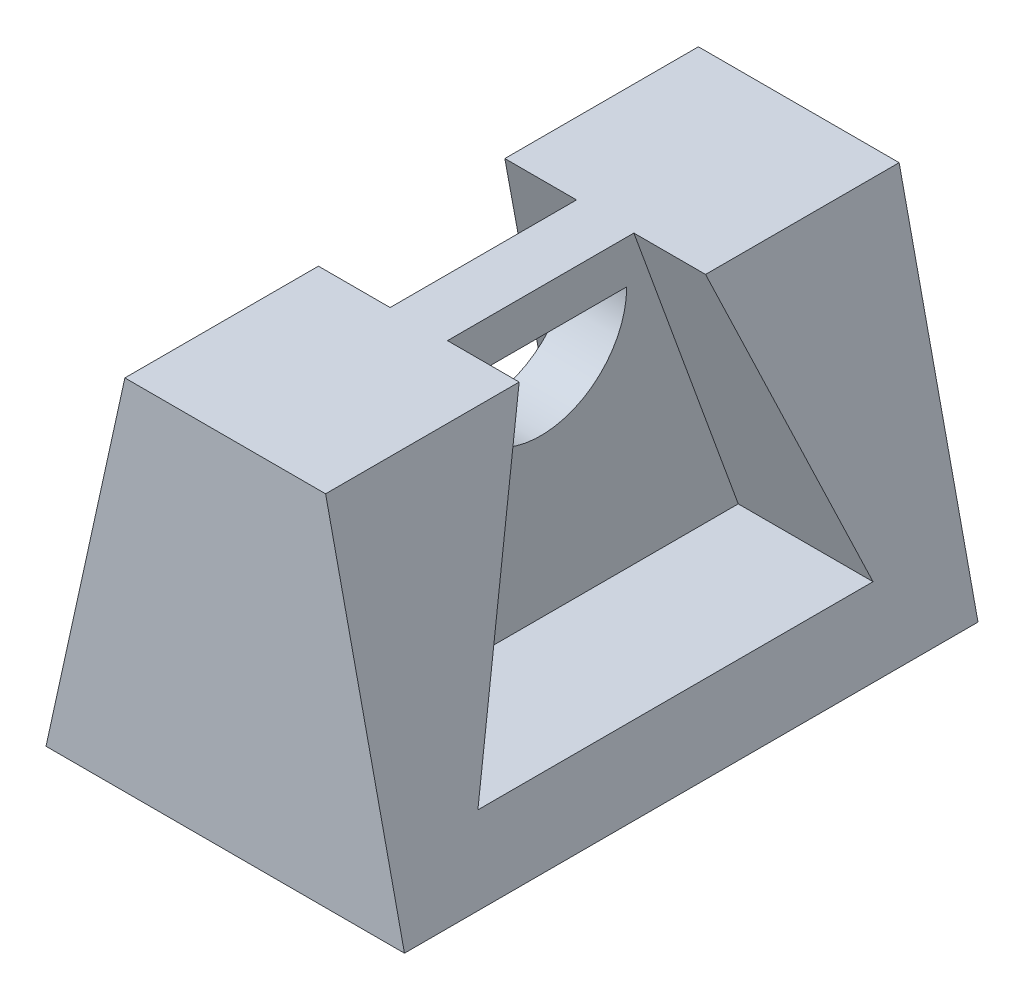
ISO-10303-21;
HEADER;
FILE_DESCRIPTION(('STEP AP214'),'2;1');
FILE_NAME('part.step','',(''),(''),'','','');
FILE_SCHEMA(('AUTOMOTIVE_DESIGN { 1 0 10303 214 1 1 1 1 }'));
ENDSEC;
DATA;
#1=APPLICATION_CONTEXT('core data for automotive mechanical design processes');
#2=APPLICATION_PROTOCOL_DEFINITION('international standard','automotive_design',2000,#1);
#3=PRODUCT_CONTEXT('',#1,'mechanical');
#4=PRODUCT('Part','Part','',(#3));
#5=PRODUCT_RELATED_PRODUCT_CATEGORY('part','',(#4));
#6=PRODUCT_DEFINITION_FORMATION('','',#4);
#7=PRODUCT_DEFINITION_CONTEXT('part definition',#1,'design');
#8=PRODUCT_DEFINITION('design','',#6,#7);
#9=PRODUCT_DEFINITION_SHAPE('','',#8);
#10=(LENGTH_UNIT() NAMED_UNIT(*) SI_UNIT(.MILLI.,.METRE.));
#11=(NAMED_UNIT(*) PLANE_ANGLE_UNIT() SI_UNIT($,.RADIAN.));
#12=(NAMED_UNIT(*) SI_UNIT($,.STERADIAN.) SOLID_ANGLE_UNIT());
#13=UNCERTAINTY_MEASURE_WITH_UNIT(LENGTH_MEASURE(1.E-05),#10,'distance_accuracy_value','');
#14=(GEOMETRIC_REPRESENTATION_CONTEXT(3) GLOBAL_UNCERTAINTY_ASSIGNED_CONTEXT((#13)) GLOBAL_UNIT_ASSIGNED_CONTEXT((#10,
#11,#12)) REPRESENTATION_CONTEXT('',''));
#15=CARTESIAN_POINT('',(0.,0.,0.));
#16=DIRECTION('',(0.,0.,1.));
#17=DIRECTION('',(1.,0.,0.));
#18=AXIS2_PLACEMENT_3D('',#15,#16,#17);
#19=CARTESIAN_POINT('',(14.,42.6470588235294,40.));
#20=DIRECTION('',(-0.97664446670509,-0.21486178267512,0.));
#21=DIRECTION('',(0.21486178267512,-0.97664446670509,0.));
#22=AXIS2_PLACEMENT_3D('',#19,#20,#21);
#23=PLANE('',#22);
#24=DIRECTION('',(-0.202451425739384,0.920233753360837,0.334937694790415));
#25=VECTOR('',#24,1.);
#26=CARTESIAN_POINT('',(10.4061434662583,58.9827703405369,-7.05428725224958));
#27=LINE('',#26,#25);
#28=CARTESIAN_POINT('',(22.8,2.64705882352941,-27.5588093706483));
#29=VERTEX_POINT('',#28);
#30=CARTESIAN_POINT('',(14.,42.6470588235294,-13.));
#31=VERTEX_POINT('',#30);
#32=EDGE_CURVE('E185',#29,#31,#27,.T.);
#33=ORIENTED_EDGE('',*,*,#32,.F.);
#34=DIRECTION('',(0.,0.,-1.));
#35=VECTOR('',#34,1.);
#36=CARTESIAN_POINT('',(22.8,2.64705882352941,40.));
#37=LINE('',#36,#35);
#38=CARTESIAN_POINT('',(22.8,2.64705882352941,27.5588093706483));
#39=VERTEX_POINT('',#38);
#40=EDGE_CURVE('E11',#39,#29,#37,.T.);
#41=ORIENTED_EDGE('',*,*,#40,.F.);
#42=DIRECTION('',(0.202451425739384,-0.920233753360837,0.334937694790415));
#43=VECTOR('',#42,1.);
#44=CARTESIAN_POINT('',(15.8308325737929,34.3250925790162,16.028948003571));
#45=LINE('',#44,#43);
#46=CARTESIAN_POINT('',(14.,42.6470588235294,13.));
#47=VERTEX_POINT('',#46);
#48=EDGE_CURVE('E180',#47,#39,#45,.T.);
#49=ORIENTED_EDGE('',*,*,#48,.F.);
#50=DIRECTION('',(0.,0.,-1.));
#51=VECTOR('',#50,1.);
#52=CARTESIAN_POINT('',(14.,42.6470588235294,40.));
#53=LINE('',#52,#51);
#54=CARTESIAN_POINT('',(14.,42.6470588235294,40.));
#55=VERTEX_POINT('',#54);
#56=EDGE_CURVE('E252',#55,#47,#53,.T.);
#57=ORIENTED_EDGE('',*,*,#56,.F.);
#58=DIRECTION('',(-0.21486178267512,0.97664446670509,0.));
#59=VECTOR('',#58,1.);
#60=CARTESIAN_POINT('',(14.,42.6470588235294,40.));
#61=LINE('',#60,#59);
#62=CARTESIAN_POINT('',(25.,-7.35294117647056,40.));
#63=VERTEX_POINT('',#62);
#64=EDGE_CURVE('E227',#63,#55,#61,.T.);
#65=ORIENTED_EDGE('',*,*,#64,.F.);
#66=DIRECTION('',(0.,0.,-1.));
#67=VECTOR('',#66,1.);
#68=CARTESIAN_POINT('',(25.,-7.35294117647056,40.));
#69=LINE('',#68,#67);
#70=CARTESIAN_POINT('',(25.,-7.35294117647056,-40.));
#71=VERTEX_POINT('',#70);
#72=EDGE_CURVE('E256',#63,#71,#69,.T.);
#73=ORIENTED_EDGE('',*,*,#72,.T.);
#74=DIRECTION('',(-0.21486178267512,0.97664446670509,0.));
#75=VECTOR('',#74,1.);
#76=CARTESIAN_POINT('',(14.,42.6470588235294,-40.));
#77=LINE('',#76,#75);
#78=CARTESIAN_POINT('',(14.,42.6470588235294,-40.));
#79=VERTEX_POINT('',#78);
#80=EDGE_CURVE('E240',#71,#79,#77,.T.);
#81=ORIENTED_EDGE('',*,*,#80,.T.);
#82=EDGE_CURVE('E251',#31,#79,#53,.T.);
#83=ORIENTED_EDGE('',*,*,#82,.F.);
#84=EDGE_LOOP('',(#33,#41,#49,#57,#65,#73,#81,#83));
#85=FACE_BOUND('',#84,.T.);
#86=ADVANCED_FACE('F39',(#85),#23,.F.);
#87=CARTESIAN_POINT('',(14.,42.6470588235294,40.));
#88=DIRECTION('',(0.,-1.,0.));
#89=DIRECTION('',(1.,0.,0.));
#90=AXIS2_PLACEMENT_3D('',#87,#88,#89);
#91=PLANE('',#90);
#92=DIRECTION('',(-1.,0.,0.));
#93=VECTOR('',#92,1.);
#94=CARTESIAN_POINT('',(14.,42.6470588235294,-13.));
#95=LINE('',#94,#93);
#96=CARTESIAN_POINT('',(4.,42.6470588235294,-13.));
#97=VERTEX_POINT('',#96);
#98=EDGE_CURVE('E48',#31,#97,#95,.T.);
#99=ORIENTED_EDGE('',*,*,#98,.F.);
#100=ORIENTED_EDGE('',*,*,#82,.T.);
#101=DIRECTION('',(-1.,0.,0.));
#102=VECTOR('',#101,1.);
#103=CARTESIAN_POINT('',(14.,42.6470588235294,-40.));
#104=LINE('',#103,#102);
#105=CARTESIAN_POINT('',(-14.,42.6470588235294,-40.));
#106=VERTEX_POINT('',#105);
#107=EDGE_CURVE('E224',#79,#106,#104,.T.);
#108=ORIENTED_EDGE('',*,*,#107,.T.);
#109=DIRECTION('',(0.,0.,-1.));
#110=VECTOR('',#109,1.);
#111=CARTESIAN_POINT('',(-14.,42.6470588235294,40.));
#112=LINE('',#111,#110);
#113=CARTESIAN_POINT('',(-14.,42.6470588235294,-13.));
#114=VERTEX_POINT('',#113);
#115=EDGE_CURVE('E233',#114,#106,#112,.T.);
#116=ORIENTED_EDGE('',*,*,#115,.F.);
#117=DIRECTION('',(1.,0.,0.));
#118=VECTOR('',#117,1.);
#119=CARTESIAN_POINT('',(14.,42.6470588235294,-13.));
#120=LINE('',#119,#118);
#121=CARTESIAN_POINT('',(-4.,42.6470588235294,-13.));
#122=VERTEX_POINT('',#121);
#123=EDGE_CURVE('E268',#114,#122,#120,.T.);
#124=ORIENTED_EDGE('',*,*,#123,.T.);
#125=DIRECTION('',(0.,0.,1.));
#126=VECTOR('',#125,1.);
#127=CARTESIAN_POINT('',(-4.,42.6470588235294,-13.));
#128=LINE('',#127,#126);
#129=CARTESIAN_POINT('',(-4.,42.6470588235294,13.));
#130=VERTEX_POINT('',#129);
#131=EDGE_CURVE('E192',#122,#130,#128,.T.);
#132=ORIENTED_EDGE('',*,*,#131,.T.);
#133=DIRECTION('',(-1.,0.,0.));
#134=VECTOR('',#133,1.);
#135=CARTESIAN_POINT('',(14.,42.6470588235294,13.));
#136=LINE('',#135,#134);
#137=CARTESIAN_POINT('',(-14.,42.6470588235294,13.));
#138=VERTEX_POINT('',#137);
#139=EDGE_CURVE('E264',#130,#138,#136,.T.);
#140=ORIENTED_EDGE('',*,*,#139,.T.);
#141=CARTESIAN_POINT('',(-14.,42.6470588235294,40.));
#142=VERTEX_POINT('',#141);
#143=EDGE_CURVE('E247',#142,#138,#112,.T.);
#144=ORIENTED_EDGE('',*,*,#143,.F.);
#145=DIRECTION('',(-1.,0.,0.));
#146=VECTOR('',#145,1.);
#147=CARTESIAN_POINT('',(14.,42.6470588235294,40.));
#148=LINE('',#147,#146);
#149=EDGE_CURVE('E230',#55,#142,#148,.T.);
#150=ORIENTED_EDGE('',*,*,#149,.F.);
#151=ORIENTED_EDGE('',*,*,#56,.T.);
#152=DIRECTION('',(1.,0.,0.));
#153=VECTOR('',#152,1.);
#154=CARTESIAN_POINT('',(14.,42.6470588235294,13.));
#155=LINE('',#154,#153);
#156=CARTESIAN_POINT('',(4.,42.6470588235294,13.));
#157=VERTEX_POINT('',#156);
#158=EDGE_CURVE('E276',#157,#47,#155,.T.);
#159=ORIENTED_EDGE('',*,*,#158,.F.);
#160=DIRECTION('',(0.,0.,1.));
#161=VECTOR('',#160,1.);
#162=CARTESIAN_POINT('',(4.,42.6470588235294,-13.));
#163=LINE('',#162,#161);
#164=EDGE_CURVE('E173',#97,#157,#163,.T.);
#165=ORIENTED_EDGE('',*,*,#164,.F.);
#166=EDGE_LOOP('',(#99,#100,#108,#116,#124,#132,#140,#144,#150,#151,#159,#165));
#167=FACE_BOUND('',#166,.T.);
#168=ADVANCED_FACE('F290',(#167),#91,.F.);
#169=CARTESIAN_POINT('',(-14.,42.6470588235294,40.));
#170=DIRECTION('',(0.97664446670509,-0.21486178267512,0.));
#171=DIRECTION('',(0.21486178267512,0.97664446670509,0.));
#172=AXIS2_PLACEMENT_3D('',#169,#170,#171);
#173=PLANE('',#172);
#174=DIRECTION('',(0.,0.,-1.));
#175=VECTOR('',#174,1.);
#176=CARTESIAN_POINT('',(-22.8,2.64705882352941,40.));
#177=LINE('',#176,#175);
#178=CARTESIAN_POINT('',(-22.8,2.64705882352941,27.5588093706483));
#179=VERTEX_POINT('',#178);
#180=CARTESIAN_POINT('',(-22.8,2.64705882352941,-27.5588093706483));
#181=VERTEX_POINT('',#180);
#182=EDGE_CURVE('E272',#179,#181,#177,.T.);
#183=ORIENTED_EDGE('',*,*,#182,.T.);
#184=DIRECTION('',(0.202451425739384,0.920233753360837,0.334937694790415));
#185=VECTOR('',#184,1.);
#186=CARTESIAN_POINT('',(-10.4061434662583,58.9827703405369,-7.05428725224959));
#187=LINE('',#186,#185);
#188=EDGE_CURVE('E214',#181,#114,#187,.T.);
#189=ORIENTED_EDGE('',*,*,#188,.T.);
#190=ORIENTED_EDGE('',*,*,#115,.T.);
#191=DIRECTION('',(-0.21486178267512,-0.97664446670509,0.));
#192=VECTOR('',#191,1.);
#193=CARTESIAN_POINT('',(-14.,42.6470588235294,-40.));
#194=LINE('',#193,#192);
#195=CARTESIAN_POINT('',(-25.,-7.35294117647059,-40.));
#196=VERTEX_POINT('',#195);
#197=EDGE_CURVE('E218',#106,#196,#194,.T.);
#198=ORIENTED_EDGE('',*,*,#197,.T.);
#199=DIRECTION('',(0.,0.,-1.));
#200=VECTOR('',#199,1.);
#201=CARTESIAN_POINT('',(-25.,-7.35294117647059,40.));
#202=LINE('',#201,#200);
#203=CARTESIAN_POINT('',(-25.,-7.35294117647059,40.));
#204=VERTEX_POINT('',#203);
#205=EDGE_CURVE('E260',#204,#196,#202,.T.);
#206=ORIENTED_EDGE('',*,*,#205,.F.);
#207=DIRECTION('',(-0.21486178267512,-0.97664446670509,0.));
#208=VECTOR('',#207,1.);
#209=CARTESIAN_POINT('',(-14.,42.6470588235294,40.));
#210=LINE('',#209,#208);
#211=EDGE_CURVE('E219',#142,#204,#210,.T.);
#212=ORIENTED_EDGE('',*,*,#211,.F.);
#213=ORIENTED_EDGE('',*,*,#143,.T.);
#214=DIRECTION('',(-0.202451425739384,-0.920233753360837,0.334937694790415));
#215=VECTOR('',#214,1.);
#216=CARTESIAN_POINT('',(-15.8308325737929,34.3250925790161,16.028948003571));
#217=LINE('',#216,#215);
#218=EDGE_CURVE('E208',#138,#179,#217,.T.);
#219=ORIENTED_EDGE('',*,*,#218,.T.);
#220=EDGE_LOOP('',(#183,#189,#190,#198,#206,#212,#213,#219));
#221=FACE_BOUND('',#220,.T.);
#222=ADVANCED_FACE('F41',(#221),#173,.F.);
#223=CARTESIAN_POINT('',(-25.,-7.35294117647059,40.));
#224=DIRECTION('',(0.,1.,0.));
#225=DIRECTION('',(-1.,0.,0.));
#226=AXIS2_PLACEMENT_3D('',#223,#224,#225);
#227=PLANE('',#226);
#228=DIRECTION('',(1.,0.,0.));
#229=VECTOR('',#228,1.);
#230=CARTESIAN_POINT('',(-25.,-7.35294117647059,-40.));
#231=LINE('',#230,#229);
#232=EDGE_CURVE('E237',#196,#71,#231,.T.);
#233=ORIENTED_EDGE('',*,*,#232,.T.);
#234=ORIENTED_EDGE('',*,*,#72,.F.);
#235=DIRECTION('',(1.,0.,0.));
#236=VECTOR('',#235,1.);
#237=CARTESIAN_POINT('',(-25.,-7.35294117647059,40.));
#238=LINE('',#237,#236);
#239=EDGE_CURVE('E223',#204,#63,#238,.T.);
#240=ORIENTED_EDGE('',*,*,#239,.F.);
#241=ORIENTED_EDGE('',*,*,#205,.T.);
#242=EDGE_LOOP('',(#233,#234,#240,#241));
#243=FACE_BOUND('',#242,.T.);
#244=ADVANCED_FACE('F317',(#243),#227,.F.);
#245=CARTESIAN_POINT('',(0.,0.,40.));
#246=DIRECTION('',(0.,0.,1.));
#247=DIRECTION('',(1.,0.,0.));
#248=AXIS2_PLACEMENT_3D('',#245,#246,#247);
#249=PLANE('',#248);
#250=ORIENTED_EDGE('',*,*,#211,.T.);
#251=ORIENTED_EDGE('',*,*,#239,.T.);
#252=ORIENTED_EDGE('',*,*,#64,.T.);
#253=ORIENTED_EDGE('',*,*,#149,.T.);
#254=EDGE_LOOP('',(#250,#251,#252,#253));
#255=FACE_BOUND('',#254,.T.);
#256=ADVANCED_FACE('F321',(#255),#249,.T.);
#257=CARTESIAN_POINT('',(0.,0.,-40.));
#258=DIRECTION('',(0.,0.,1.));
#259=DIRECTION('',(1.,0.,0.));
#260=AXIS2_PLACEMENT_3D('',#257,#258,#259);
#261=PLANE('',#260);
#262=ORIENTED_EDGE('',*,*,#197,.F.);
#263=ORIENTED_EDGE('',*,*,#107,.F.);
#264=ORIENTED_EDGE('',*,*,#80,.F.);
#265=ORIENTED_EDGE('',*,*,#232,.F.);
#266=EDGE_LOOP('',(#262,#263,#264,#265));
#267=FACE_BOUND('',#266,.T.);
#268=ADVANCED_FACE('F314',(#267),#261,.F.);
#269=CARTESIAN_POINT('',(-54.,2.64705882352941,27.5588093706483));
#270=DIRECTION('',(0.,-1.,0.));
#271=DIRECTION('',(0.,0.,-1.));
#272=AXIS2_PLACEMENT_3D('',#269,#270,#271);
#273=PLANE('',#272);
#274=DIRECTION('',(1.,0.,0.));
#275=VECTOR('',#274,1.);
#276=CARTESIAN_POINT('',(-54.,2.64705882352941,27.5588093706483));
#277=LINE('',#276,#275);
#278=CARTESIAN_POINT('',(-4.,2.64705882352941,27.5588093706483));
#279=VERTEX_POINT('',#278);
#280=EDGE_CURVE('E204',#179,#279,#277,.T.);
#281=ORIENTED_EDGE('',*,*,#280,.T.);
#282=DIRECTION('',(0.,0.,-1.));
#283=VECTOR('',#282,1.);
#284=CARTESIAN_POINT('',(-4.,2.64705882352941,27.5588093706483));
#285=LINE('',#284,#283);
#286=CARTESIAN_POINT('',(-4.,2.64705882352941,-27.5588093706483));
#287=VERTEX_POINT('',#286);
#288=EDGE_CURVE('E200',#279,#287,#285,.T.);
#289=ORIENTED_EDGE('',*,*,#288,.T.);
#290=DIRECTION('',(1.,0.,0.));
#291=VECTOR('',#290,1.);
#292=CARTESIAN_POINT('',(-54.,2.64705882352941,-27.5588093706483));
#293=LINE('',#292,#291);
#294=EDGE_CURVE('E205',#181,#287,#293,.T.);
#295=ORIENTED_EDGE('',*,*,#294,.F.);
#296=ORIENTED_EDGE('',*,*,#182,.F.);
#297=EDGE_LOOP('',(#281,#289,#295,#296));
#298=FACE_BOUND('',#297,.T.);
#299=ADVANCED_FACE('F331',(#298),#273,.F.);
#300=CARTESIAN_POINT('',(-54.,42.6470588235294,-13.));
#301=DIRECTION('',(0.,0.342020143325673,-0.939692620785907));
#302=DIRECTION('',(0.,0.939692620785907,0.342020143325673));
#303=AXIS2_PLACEMENT_3D('',#300,#301,#302);
#304=PLANE('',#303);
#305=ORIENTED_EDGE('',*,*,#294,.T.);
#306=DIRECTION('',(0.,0.939692620785907,0.342020143325673));
#307=VECTOR('',#306,1.);
#308=CARTESIAN_POINT('',(-4.,42.6470588235294,-13.));
#309=LINE('',#308,#307);
#310=EDGE_CURVE('E188',#287,#122,#309,.T.);
#311=ORIENTED_EDGE('',*,*,#310,.T.);
#312=ORIENTED_EDGE('',*,*,#123,.F.);
#313=ORIENTED_EDGE('',*,*,#188,.F.);
#314=EDGE_LOOP('',(#305,#311,#312,#313));
#315=FACE_BOUND('',#314,.T.);
#316=ADVANCED_FACE('F334',(#315),#304,.F.);
#317=CARTESIAN_POINT('',(-54.,42.6470588235294,13.));
#318=DIRECTION('',(0.,0.342020143325673,0.939692620785907));
#319=DIRECTION('',(0.,-0.939692620785907,0.342020143325673));
#320=AXIS2_PLACEMENT_3D('',#317,#318,#319);
#321=PLANE('',#320);
#322=ORIENTED_EDGE('',*,*,#139,.F.);
#323=DIRECTION('',(0.,-0.939692620785907,0.342020143325673));
#324=VECTOR('',#323,1.);
#325=CARTESIAN_POINT('',(-4.,42.6470588235294,13.));
#326=LINE('',#325,#324);
#327=EDGE_CURVE('E196',#130,#279,#326,.T.);
#328=ORIENTED_EDGE('',*,*,#327,.T.);
#329=ORIENTED_EDGE('',*,*,#280,.F.);
#330=ORIENTED_EDGE('',*,*,#218,.F.);
#331=EDGE_LOOP('',(#322,#328,#329,#330));
#332=FACE_BOUND('',#331,.T.);
#333=ADVANCED_FACE('F326',(#332),#321,.F.);
#334=CARTESIAN_POINT('',(-4.,0.,0.));
#335=DIRECTION('',(1.,0.,0.));
#336=DIRECTION('',(0.,0.,-1.));
#337=AXIS2_PLACEMENT_3D('',#334,#335,#336);
#338=PLANE('',#337);
#339=DIRECTION('',(0.,0.,-1.));
#340=VECTOR('',#339,1.);
#341=CARTESIAN_POINT('',(-4.,36.6470588235294,-12.));
#342=LINE('',#341,#340);
#343=CARTESIAN_POINT('',(-4.,36.6470588235294,12.));
#344=VERTEX_POINT('',#343);
#345=CARTESIAN_POINT('',(-4.,36.6470588235294,-12.));
#346=VERTEX_POINT('',#345);
#347=EDGE_CURVE('E146',#344,#346,#342,.T.);
#348=ORIENTED_EDGE('',*,*,#347,.F.);
#349=CARTESIAN_POINT('',(-4.,36.6470588235294,0.));
#350=DIRECTION('',(-1.,0.,0.));
#351=DIRECTION('',(0.,0.,1.));
#352=AXIS2_PLACEMENT_3D('',#349,#350,#351);
#353=CIRCLE('',#352,12.);
#354=EDGE_CURVE('E55',#346,#344,#353,.T.);
#355=ORIENTED_EDGE('',*,*,#354,.F.);
#356=EDGE_LOOP('',(#348,#355));
#357=FACE_BOUND('',#356,.T.);
#358=ORIENTED_EDGE('',*,*,#310,.F.);
#359=ORIENTED_EDGE('',*,*,#288,.F.);
#360=ORIENTED_EDGE('',*,*,#327,.F.);
#361=ORIENTED_EDGE('',*,*,#131,.F.);
#362=EDGE_LOOP('',(#358,#359,#360,#361));
#363=FACE_BOUND('',#362,.T.);
#364=ADVANCED_FACE('F151',(#357,#363),#338,.F.);
#365=CARTESIAN_POINT('',(54.,2.64705882352941,27.5588093706483));
#366=DIRECTION('',(0.,1.,0.));
#367=DIRECTION('',(0.,0.,1.));
#368=AXIS2_PLACEMENT_3D('',#365,#366,#367);
#369=PLANE('',#368);
#370=ORIENTED_EDGE('',*,*,#40,.T.);
#371=DIRECTION('',(-1.,0.,0.));
#372=VECTOR('',#371,1.);
#373=CARTESIAN_POINT('',(54.,2.64705882352941,-27.5588093706483));
#374=LINE('',#373,#372);
#375=CARTESIAN_POINT('',(4.,2.64705882352941,-27.5588093706483));
#376=VERTEX_POINT('',#375);
#377=EDGE_CURVE('E176',#29,#376,#374,.T.);
#378=ORIENTED_EDGE('',*,*,#377,.T.);
#379=DIRECTION('',(0.,0.,-1.));
#380=VECTOR('',#379,1.);
#381=CARTESIAN_POINT('',(4.,2.64705882352941,27.5588093706483));
#382=LINE('',#381,#380);
#383=CARTESIAN_POINT('',(4.,2.64705882352941,27.5588093706483));
#384=VERTEX_POINT('',#383);
#385=EDGE_CURVE('E165',#384,#376,#382,.T.);
#386=ORIENTED_EDGE('',*,*,#385,.F.);
#387=DIRECTION('',(-1.,0.,0.));
#388=VECTOR('',#387,1.);
#389=CARTESIAN_POINT('',(54.,2.64705882352941,27.5588093706483));
#390=LINE('',#389,#388);
#391=EDGE_CURVE('E177',#39,#384,#390,.T.);
#392=ORIENTED_EDGE('',*,*,#391,.F.);
#393=EDGE_LOOP('',(#370,#378,#386,#392));
#394=FACE_BOUND('',#393,.T.);
#395=ADVANCED_FACE('F301',(#394),#369,.T.);
#396=CARTESIAN_POINT('',(54.,42.6470588235294,-13.));
#397=DIRECTION('',(0.,-0.342020143325673,0.939692620785907));
#398=DIRECTION('',(0.,-0.939692620785907,-0.342020143325673));
#399=AXIS2_PLACEMENT_3D('',#396,#397,#398);
#400=PLANE('',#399);
#401=ORIENTED_EDGE('',*,*,#32,.T.);
#402=ORIENTED_EDGE('',*,*,#98,.T.);
#403=DIRECTION('',(0.,0.939692620785907,0.342020143325673));
#404=VECTOR('',#403,1.);
#405=CARTESIAN_POINT('',(4.,42.6470588235294,-13.));
#406=LINE('',#405,#404);
#407=EDGE_CURVE('E162',#376,#97,#406,.T.);
#408=ORIENTED_EDGE('',*,*,#407,.F.);
#409=ORIENTED_EDGE('',*,*,#377,.F.);
#410=EDGE_LOOP('',(#401,#402,#408,#409));
#411=FACE_BOUND('',#410,.T.);
#412=ADVANCED_FACE('F284',(#411),#400,.T.);
#413=CARTESIAN_POINT('',(54.,42.6470588235294,13.));
#414=DIRECTION('',(0.,-0.342020143325673,-0.939692620785907));
#415=DIRECTION('',(0.,0.939692620785907,-0.342020143325673));
#416=AXIS2_PLACEMENT_3D('',#413,#414,#415);
#417=PLANE('',#416);
#418=ORIENTED_EDGE('',*,*,#48,.T.);
#419=ORIENTED_EDGE('',*,*,#391,.T.);
#420=DIRECTION('',(0.,-0.939692620785907,0.342020143325673));
#421=VECTOR('',#420,1.);
#422=CARTESIAN_POINT('',(4.,42.6470588235294,13.));
#423=LINE('',#422,#421);
#424=EDGE_CURVE('E169',#157,#384,#423,.T.);
#425=ORIENTED_EDGE('',*,*,#424,.F.);
#426=ORIENTED_EDGE('',*,*,#158,.T.);
#427=EDGE_LOOP('',(#418,#419,#425,#426));
#428=FACE_BOUND('',#427,.T.);
#429=ADVANCED_FACE('F296',(#428),#417,.T.);
#430=CARTESIAN_POINT('',(4.,0.,0.));
#431=DIRECTION('',(-1.,0.,0.));
#432=DIRECTION('',(0.,0.,-1.));
#433=AXIS2_PLACEMENT_3D('',#430,#431,#432);
#434=PLANE('',#433);
#435=DIRECTION('',(0.,0.,1.));
#436=VECTOR('',#435,1.);
#437=CARTESIAN_POINT('',(4.,36.6470588235294,-12.));
#438=LINE('',#437,#436);
#439=CARTESIAN_POINT('',(4.,36.6470588235294,-12.));
#440=VERTEX_POINT('',#439);
#441=CARTESIAN_POINT('',(4.,36.6470588235294,12.));
#442=VERTEX_POINT('',#441);
#443=EDGE_CURVE('E159',#440,#442,#438,.T.);
#444=ORIENTED_EDGE('',*,*,#443,.F.);
#445=CARTESIAN_POINT('',(4.,36.6470588235294,0.));
#446=DIRECTION('',(-1.,0.,0.));
#447=DIRECTION('',(0.,0.,1.));
#448=AXIS2_PLACEMENT_3D('',#445,#446,#447);
#449=CIRCLE('',#448,12.);
#450=EDGE_CURVE('E140',#442,#440,#449,.F.);
#451=ORIENTED_EDGE('',*,*,#450,.F.);
#452=EDGE_LOOP('',(#444,#451));
#453=FACE_BOUND('',#452,.T.);
#454=ORIENTED_EDGE('',*,*,#407,.T.);
#455=ORIENTED_EDGE('',*,*,#164,.T.);
#456=ORIENTED_EDGE('',*,*,#424,.T.);
#457=ORIENTED_EDGE('',*,*,#385,.T.);
#458=EDGE_LOOP('',(#454,#455,#456,#457));
#459=FACE_BOUND('',#458,.T.);
#460=ADVANCED_FACE('F293',(#453,#459),#434,.F.);
#461=CARTESIAN_POINT('',(30.8328157299975,36.6470588235294,0.));
#462=DIRECTION('',(-1.,0.,0.));
#463=DIRECTION('',(0.,0.,1.));
#464=AXIS2_PLACEMENT_3D('',#461,#462,#463);
#465=CYLINDRICAL_SURFACE('',#464,12.);
#466=ORIENTED_EDGE('',*,*,#450,.T.);
#467=DIRECTION('',(-1.,0.,0.));
#468=VECTOR('',#467,1.);
#469=CARTESIAN_POINT('',(30.8328157299975,36.6470588235294,-12.));
#470=LINE('',#469,#468);
#471=EDGE_CURVE('E62',#440,#346,#470,.T.);
#472=ORIENTED_EDGE('',*,*,#471,.T.);
#473=ORIENTED_EDGE('',*,*,#354,.T.);
#474=DIRECTION('',(-1.,0.,0.));
#475=VECTOR('',#474,1.);
#476=CARTESIAN_POINT('',(30.8328157299975,36.6470588235294,12.));
#477=LINE('',#476,#475);
#478=EDGE_CURVE('E143',#442,#344,#477,.T.);
#479=ORIENTED_EDGE('',*,*,#478,.F.);
#480=EDGE_LOOP('',(#466,#472,#473,#479));
#481=FACE_BOUND('',#480,.T.);
#482=ADVANCED_FACE('F138',(#481),#465,.F.);
#483=CARTESIAN_POINT('',(30.8328157299975,36.6470588235294,-12.));
#484=DIRECTION('',(0.,1.,0.));
#485=DIRECTION('',(0.,0.,1.));
#486=AXIS2_PLACEMENT_3D('',#483,#484,#485);
#487=PLANE('',#486);
#488=ORIENTED_EDGE('',*,*,#443,.T.);
#489=ORIENTED_EDGE('',*,*,#478,.T.);
#490=ORIENTED_EDGE('',*,*,#347,.T.);
#491=ORIENTED_EDGE('',*,*,#471,.F.);
#492=EDGE_LOOP('',(#488,#489,#490,#491));
#493=FACE_BOUND('',#492,.T.);
#494=ADVANCED_FACE('F147',(#493),#487,.F.);
#495=CLOSED_SHELL('',(#86,#168,#222,#244,#256,#268,#299,#316,#333,#364,#395,#412,#429,#460,#482,#494));
#496=MANIFOLD_SOLID_BREP('B2',#495);
#497=ADVANCED_BREP_SHAPE_REPRESENTATION('',(#18,#496),#14);
#498=SHAPE_DEFINITION_REPRESENTATION(#9,#497);
ENDSEC;
END-ISO-10303-21;
